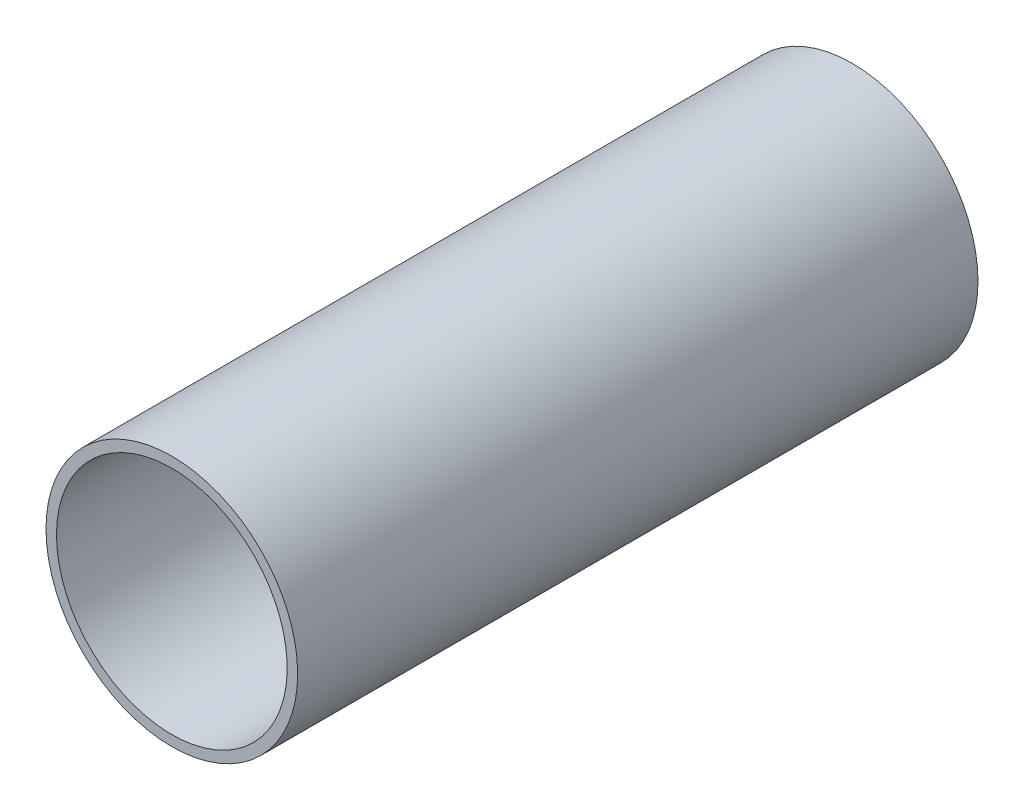
ISO-10303-21;
HEADER;
FILE_DESCRIPTION(('STEP AP214'),'2;1');
FILE_NAME('part.step','',(''),(''),'','','');
FILE_SCHEMA(('AUTOMOTIVE_DESIGN { 1 0 10303 214 1 1 1 1 }'));
ENDSEC;
DATA;
#1=APPLICATION_CONTEXT('core data for automotive mechanical design processes');
#2=APPLICATION_PROTOCOL_DEFINITION('international standard','automotive_design',2000,#1);
#3=PRODUCT_CONTEXT('',#1,'mechanical');
#4=PRODUCT('Part','Part','',(#3));
#5=PRODUCT_RELATED_PRODUCT_CATEGORY('part','',(#4));
#6=PRODUCT_DEFINITION_FORMATION('','',#4);
#7=PRODUCT_DEFINITION_CONTEXT('part definition',#1,'design');
#8=PRODUCT_DEFINITION('design','',#6,#7);
#9=PRODUCT_DEFINITION_SHAPE('','',#8);
#10=(LENGTH_UNIT() NAMED_UNIT(*) SI_UNIT(.MILLI.,.METRE.));
#11=(NAMED_UNIT(*) PLANE_ANGLE_UNIT() SI_UNIT($,.RADIAN.));
#12=(NAMED_UNIT(*) SI_UNIT($,.STERADIAN.) SOLID_ANGLE_UNIT());
#13=UNCERTAINTY_MEASURE_WITH_UNIT(LENGTH_MEASURE(1.E-05),#10,'distance_accuracy_value','');
#14=(GEOMETRIC_REPRESENTATION_CONTEXT(3) GLOBAL_UNCERTAINTY_ASSIGNED_CONTEXT((#13)) GLOBAL_UNIT_ASSIGNED_CONTEXT((#10,
#11,#12)) REPRESENTATION_CONTEXT('',''));
#15=CARTESIAN_POINT('',(0.,0.,0.));
#16=DIRECTION('',(0.,0.,1.));
#17=DIRECTION('',(1.,0.,0.));
#18=AXIS2_PLACEMENT_3D('',#15,#16,#17);
#19=CARTESIAN_POINT('',(0.,0.,0.));
#20=DIRECTION('',(0.,0.,1.));
#21=DIRECTION('',(1.,0.,0.));
#22=AXIS2_PLACEMENT_3D('',#19,#20,#21);
#23=PLANE('',#22);
#24=CARTESIAN_POINT('',(0.,0.,0.));
#25=DIRECTION('',(0.,0.,-1.));
#26=DIRECTION('',(-1.,0.,0.));
#27=AXIS2_PLACEMENT_3D('',#24,#25,#26);
#28=CIRCLE('',#27,69.85);
#29=CARTESIAN_POINT('',(-69.85,0.,0.));
#30=VERTEX_POINT('',#29);
#31=EDGE_CURVE('E45',#30,#30,#28,.T.);
#32=ORIENTED_EDGE('',*,*,#31,.F.);
#33=EDGE_LOOP('',(#32));
#34=FACE_BOUND('',#33,.T.);
#35=CARTESIAN_POINT('',(0.,0.,0.));
#36=DIRECTION('',(0.,0.,1.));
#37=DIRECTION('',(1.,0.,0.));
#38=AXIS2_PLACEMENT_3D('',#35,#36,#37);
#39=CIRCLE('',#38,76.2);
#40=CARTESIAN_POINT('',(76.2,0.,0.));
#41=VERTEX_POINT('',#40);
#42=EDGE_CURVE('E10',#41,#41,#39,.T.);
#43=ORIENTED_EDGE('',*,*,#42,.F.);
#44=EDGE_LOOP('',(#43));
#45=FACE_BOUND('',#44,.T.);
#46=ADVANCED_FACE('F33',(#34,#45),#23,.F.);
#47=CARTESIAN_POINT('',(0.,0.,0.));
#48=DIRECTION('',(0.,0.,1.));
#49=DIRECTION('',(1.,0.,0.));
#50=AXIS2_PLACEMENT_3D('',#47,#48,#49);
#51=CYLINDRICAL_SURFACE('',#50,76.2);
#52=ORIENTED_EDGE('',*,*,#42,.T.);
#53=EDGE_LOOP('',(#52));
#54=FACE_BOUND('',#53,.T.);
#55=CARTESIAN_POINT('',(0.,0.,412.));
#56=DIRECTION('',(0.,0.,1.));
#57=DIRECTION('',(1.,0.,0.));
#58=AXIS2_PLACEMENT_3D('',#55,#56,#57);
#59=CIRCLE('',#58,76.2);
#60=CARTESIAN_POINT('',(76.2,0.,412.));
#61=VERTEX_POINT('',#60);
#62=EDGE_CURVE('E36',#61,#61,#59,.T.);
#63=ORIENTED_EDGE('',*,*,#62,.F.);
#64=EDGE_LOOP('',(#63));
#65=FACE_BOUND('',#64,.T.);
#66=ADVANCED_FACE('F62',(#54,#65),#51,.T.);
#67=CARTESIAN_POINT('',(0.,0.,412.));
#68=DIRECTION('',(0.,0.,1.));
#69=DIRECTION('',(1.,0.,0.));
#70=AXIS2_PLACEMENT_3D('',#67,#68,#69);
#71=PLANE('',#70);
#72=CARTESIAN_POINT('',(0.,0.,412.));
#73=DIRECTION('',(0.,0.,-1.));
#74=DIRECTION('',(-1.,0.,0.));
#75=AXIS2_PLACEMENT_3D('',#72,#73,#74);
#76=CIRCLE('',#75,69.85);
#77=CARTESIAN_POINT('',(-69.85,0.,412.));
#78=VERTEX_POINT('',#77);
#79=EDGE_CURVE('E43',#78,#78,#76,.T.);
#80=ORIENTED_EDGE('',*,*,#79,.T.);
#81=EDGE_LOOP('',(#80));
#82=FACE_BOUND('',#81,.T.);
#83=ORIENTED_EDGE('',*,*,#62,.T.);
#84=EDGE_LOOP('',(#83));
#85=FACE_BOUND('',#84,.T.);
#86=ADVANCED_FACE('F51',(#82,#85),#71,.T.);
#87=CARTESIAN_POINT('',(0.,0.,412.));
#88=DIRECTION('',(0.,0.,-1.));
#89=DIRECTION('',(-1.,0.,0.));
#90=AXIS2_PLACEMENT_3D('',#87,#88,#89);
#91=CYLINDRICAL_SURFACE('',#90,69.85);
#92=ORIENTED_EDGE('',*,*,#79,.F.);
#93=EDGE_LOOP('',(#92));
#94=FACE_BOUND('',#93,.T.);
#95=ORIENTED_EDGE('',*,*,#31,.T.);
#96=EDGE_LOOP('',(#95));
#97=FACE_BOUND('',#96,.T.);
#98=ADVANCED_FACE('F54',(#94,#97),#91,.F.);
#99=CLOSED_SHELL('',(#46,#66,#86,#98));
#100=MANIFOLD_SOLID_BREP('B2',#99);
#101=ADVANCED_BREP_SHAPE_REPRESENTATION('',(#18,#100),#14);
#102=SHAPE_DEFINITION_REPRESENTATION(#9,#101);
ENDSEC;
END-ISO-10303-21;
